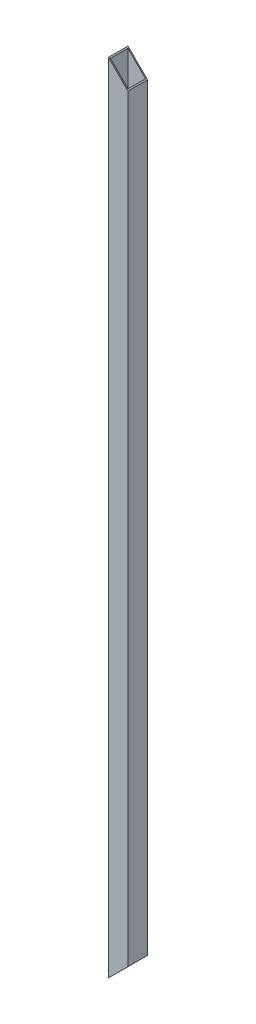
ISO-10303-21;
HEADER;
FILE_DESCRIPTION(('STEP AP214'),'2;1');
FILE_NAME('part.step','',(''),(''),'','','');
FILE_SCHEMA(('AUTOMOTIVE_DESIGN { 1 0 10303 214 1 1 1 1 }'));
ENDSEC;
DATA;
#1=APPLICATION_CONTEXT('core data for automotive mechanical design processes');
#2=APPLICATION_PROTOCOL_DEFINITION('international standard','automotive_design',2000,#1);
#3=PRODUCT_CONTEXT('',#1,'mechanical');
#4=PRODUCT('Part','Part','',(#3));
#5=PRODUCT_RELATED_PRODUCT_CATEGORY('part','',(#4));
#6=PRODUCT_DEFINITION_FORMATION('','',#4);
#7=PRODUCT_DEFINITION_CONTEXT('part definition',#1,'design');
#8=PRODUCT_DEFINITION('design','',#6,#7);
#9=PRODUCT_DEFINITION_SHAPE('','',#8);
#10=(LENGTH_UNIT() NAMED_UNIT(*) SI_UNIT(.MILLI.,.METRE.));
#11=(NAMED_UNIT(*) PLANE_ANGLE_UNIT() SI_UNIT($,.RADIAN.));
#12=(NAMED_UNIT(*) SI_UNIT($,.STERADIAN.) SOLID_ANGLE_UNIT());
#13=UNCERTAINTY_MEASURE_WITH_UNIT(LENGTH_MEASURE(1.E-05),#10,'distance_accuracy_value','');
#14=(GEOMETRIC_REPRESENTATION_CONTEXT(3) GLOBAL_UNCERTAINTY_ASSIGNED_CONTEXT((#13)) GLOBAL_UNIT_ASSIGNED_CONTEXT((#10,
#11,#12)) REPRESENTATION_CONTEXT('',''));
#15=CARTESIAN_POINT('',(0.,0.,0.));
#16=DIRECTION('',(0.,0.,1.));
#17=DIRECTION('',(1.,0.,0.));
#18=AXIS2_PLACEMENT_3D('',#15,#16,#17);
#19=CARTESIAN_POINT('',(925.,-56.568542494924,-40.));
#20=DIRECTION('',(0.,0.,-1.));
#21=DIRECTION('',(-1.,0.,0.));
#22=AXIS2_PLACEMENT_3D('',#19,#20,#21);
#23=PLANE('',#22);
#24=DIRECTION('',(0.707106781186551,-0.707106781186544,0.));
#25=VECTOR('',#24,1.);
#26=CARTESIAN_POINT('',(1278.25,1278.25000000001,-40.));
#27=LINE('',#26,#25);
#28=CARTESIAN_POINT('',(925.,1631.5,-40.));
#29=VERTEX_POINT('',#28);
#30=CARTESIAN_POINT('',(965.,1591.5,-40.));
#31=VERTEX_POINT('',#30);
#32=EDGE_CURVE('E100',#29,#31,#27,.T.);
#33=ORIENTED_EDGE('',*,*,#32,.T.);
#34=DIRECTION('',(0.,1.,0.));
#35=VECTOR('',#34,1.);
#36=CARTESIAN_POINT('',(965.,-56.568542494924,-40.));
#37=LINE('',#36,#35);
#38=CARTESIAN_POINT('',(965.,39.9999999999991,-40.));
#39=VERTEX_POINT('',#38);
#40=EDGE_CURVE('E113',#39,#31,#37,.T.);
#41=ORIENTED_EDGE('',*,*,#40,.F.);
#42=DIRECTION('',(0.707106781186551,0.707106781186544,0.));
#43=VECTOR('',#42,1.);
#44=CARTESIAN_POINT('',(462.499999999995,-462.5,-40.));
#45=LINE('',#44,#43);
#46=CARTESIAN_POINT('',(925.,0.,-40.));
#47=VERTEX_POINT('',#46);
#48=EDGE_CURVE('E151',#47,#39,#45,.T.);
#49=ORIENTED_EDGE('',*,*,#48,.F.);
#50=DIRECTION('',(0.,1.,0.));
#51=VECTOR('',#50,1.);
#52=CARTESIAN_POINT('',(925.,-56.568542494924,-40.));
#53=LINE('',#52,#51);
#54=EDGE_CURVE('E115',#47,#29,#53,.T.);
#55=ORIENTED_EDGE('',*,*,#54,.T.);
#56=EDGE_LOOP('',(#33,#41,#49,#55));
#57=FACE_BOUND('',#56,.T.);
#58=ADVANCED_FACE('F33',(#57),#23,.T.);
#59=CARTESIAN_POINT('',(965.,-56.568542494924,0.));
#60=DIRECTION('',(1.,0.,0.));
#61=DIRECTION('',(0.,0.,-1.));
#62=AXIS2_PLACEMENT_3D('',#59,#60,#61);
#63=PLANE('',#62);
#64=DIRECTION('',(0.,0.,1.));
#65=VECTOR('',#64,1.);
#66=CARTESIAN_POINT('',(965.,1591.5,-96.5685424949234));
#67=LINE('',#66,#65);
#68=CARTESIAN_POINT('',(965.,1591.5,0.));
#69=VERTEX_POINT('',#68);
#70=EDGE_CURVE('E97',#31,#69,#67,.T.);
#71=ORIENTED_EDGE('',*,*,#70,.T.);
#72=DIRECTION('',(0.,1.,0.));
#73=VECTOR('',#72,1.);
#74=CARTESIAN_POINT('',(965.,-56.568542494924,0.));
#75=LINE('',#74,#73);
#76=CARTESIAN_POINT('',(965.,39.9999999999991,0.));
#77=VERTEX_POINT('',#76);
#78=EDGE_CURVE('E121',#77,#69,#75,.T.);
#79=ORIENTED_EDGE('',*,*,#78,.F.);
#80=DIRECTION('',(0.,0.,1.));
#81=VECTOR('',#80,1.);
#82=CARTESIAN_POINT('',(965.,39.9999999999991,-96.5685424949234));
#83=LINE('',#82,#81);
#84=EDGE_CURVE('E120',#39,#77,#83,.T.);
#85=ORIENTED_EDGE('',*,*,#84,.F.);
#86=ORIENTED_EDGE('',*,*,#40,.T.);
#87=EDGE_LOOP('',(#71,#79,#85,#86));
#88=FACE_BOUND('',#87,.T.);
#89=ADVANCED_FACE('F119',(#88),#63,.T.);
#90=CARTESIAN_POINT('',(925.,-56.568542494924,0.));
#91=DIRECTION('',(0.,0.,1.));
#92=DIRECTION('',(1.,0.,0.));
#93=AXIS2_PLACEMENT_3D('',#90,#91,#92);
#94=PLANE('',#93);
#95=DIRECTION('',(0.707106781186551,-0.707106781186544,0.));
#96=VECTOR('',#95,1.);
#97=CARTESIAN_POINT('',(1278.25,1278.25000000001,0.));
#98=LINE('',#97,#96);
#99=CARTESIAN_POINT('',(925.,1631.5,0.));
#100=VERTEX_POINT('',#99);
#101=EDGE_CURVE('E103',#100,#69,#98,.T.);
#102=ORIENTED_EDGE('',*,*,#101,.F.);
#103=DIRECTION('',(0.,1.,0.));
#104=VECTOR('',#103,1.);
#105=CARTESIAN_POINT('',(925.,-56.568542494924,0.));
#106=LINE('',#105,#104);
#107=CARTESIAN_POINT('',(925.,0.,0.));
#108=VERTEX_POINT('',#107);
#109=EDGE_CURVE('E125',#108,#100,#106,.T.);
#110=ORIENTED_EDGE('',*,*,#109,.F.);
#111=DIRECTION('',(0.707106781186551,0.707106781186544,0.));
#112=VECTOR('',#111,1.);
#113=CARTESIAN_POINT('',(462.499999999995,-462.5,0.));
#114=LINE('',#113,#112);
#115=EDGE_CURVE('E158',#108,#77,#114,.T.);
#116=ORIENTED_EDGE('',*,*,#115,.T.);
#117=ORIENTED_EDGE('',*,*,#78,.T.);
#118=EDGE_LOOP('',(#102,#110,#116,#117));
#119=FACE_BOUND('',#118,.T.);
#120=ADVANCED_FACE('F173',(#119),#94,.T.);
#121=CARTESIAN_POINT('',(927.,-56.568542494924,-2.));
#122=DIRECTION('',(-1.,0.,0.));
#123=DIRECTION('',(0.,0.,1.));
#124=AXIS2_PLACEMENT_3D('',#121,#122,#123);
#125=PLANE('',#124);
#126=DIRECTION('',(0.,1.,0.));
#127=VECTOR('',#126,1.);
#128=CARTESIAN_POINT('',(927.,-56.568542494924,-38.));
#129=LINE('',#128,#127);
#130=CARTESIAN_POINT('',(927.,1.99999999999949,-38.));
#131=VERTEX_POINT('',#130);
#132=CARTESIAN_POINT('',(927.,1629.5,-38.));
#133=VERTEX_POINT('',#132);
#134=EDGE_CURVE('E123',#131,#133,#129,.T.);
#135=ORIENTED_EDGE('',*,*,#134,.T.);
#136=DIRECTION('',(0.,0.,1.));
#137=VECTOR('',#136,1.);
#138=CARTESIAN_POINT('',(927.,1629.5,-2.));
#139=LINE('',#138,#137);
#140=CARTESIAN_POINT('',(927.,1629.5,-2.));
#141=VERTEX_POINT('',#140);
#142=EDGE_CURVE('E149',#133,#141,#139,.T.);
#143=ORIENTED_EDGE('',*,*,#142,.T.);
#144=DIRECTION('',(0.,1.,0.));
#145=VECTOR('',#144,1.);
#146=CARTESIAN_POINT('',(927.,-56.568542494924,-2.));
#147=LINE('',#146,#145);
#148=CARTESIAN_POINT('',(927.,1.99999999999954,-2.));
#149=VERTEX_POINT('',#148);
#150=EDGE_CURVE('E37',#149,#141,#147,.T.);
#151=ORIENTED_EDGE('',*,*,#150,.F.);
#152=DIRECTION('',(0.,0.,1.));
#153=VECTOR('',#152,1.);
#154=CARTESIAN_POINT('',(927.,1.99999999999949,-2.));
#155=LINE('',#154,#153);
#156=EDGE_CURVE('E57',#131,#149,#155,.T.);
#157=ORIENTED_EDGE('',*,*,#156,.F.);
#158=EDGE_LOOP('',(#135,#143,#151,#157));
#159=FACE_BOUND('',#158,.T.);
#160=ADVANCED_FACE('F35',(#159),#125,.F.);
#161=CARTESIAN_POINT('',(927.,-56.568542494924,-38.));
#162=DIRECTION('',(0.,0.,-1.));
#163=DIRECTION('',(-1.,0.,0.));
#164=AXIS2_PLACEMENT_3D('',#161,#162,#163);
#165=PLANE('',#164);
#166=DIRECTION('',(0.,1.,0.));
#167=VECTOR('',#166,1.);
#168=CARTESIAN_POINT('',(963.,-56.568542494924,-38.));
#169=LINE('',#168,#167);
#170=CARTESIAN_POINT('',(963.,37.9999999999991,-38.));
#171=VERTEX_POINT('',#170);
#172=CARTESIAN_POINT('',(963.,1593.5,-38.));
#173=VERTEX_POINT('',#172);
#174=EDGE_CURVE('E134',#171,#173,#169,.T.);
#175=ORIENTED_EDGE('',*,*,#174,.T.);
#176=DIRECTION('',(-0.707106781186551,0.707106781186544,0.));
#177=VECTOR('',#176,1.);
#178=CARTESIAN_POINT('',(1770.03427124746,786.465728752548,-38.));
#179=LINE('',#178,#177);
#180=EDGE_CURVE('E152',#173,#133,#179,.T.);
#181=ORIENTED_EDGE('',*,*,#180,.T.);
#182=ORIENTED_EDGE('',*,*,#134,.F.);
#183=DIRECTION('',(-0.707106781186551,-0.707106781186544,0.));
#184=VECTOR('',#183,1.);
#185=CARTESIAN_POINT('',(897.715728752538,-27.284271247462,-38.));
#186=LINE('',#185,#184);
#187=EDGE_CURVE('E165',#171,#131,#186,.T.);
#188=ORIENTED_EDGE('',*,*,#187,.F.);
#189=EDGE_LOOP('',(#175,#181,#182,#188));
#190=FACE_BOUND('',#189,.T.);
#191=ADVANCED_FACE('F180',(#190),#165,.F.);
#192=CARTESIAN_POINT('',(963.,-56.568542494924,-2.));
#193=DIRECTION('',(1.,0.,0.));
#194=DIRECTION('',(0.,0.,-1.));
#195=AXIS2_PLACEMENT_3D('',#192,#193,#194);
#196=PLANE('',#195);
#197=DIRECTION('',(0.,1.,0.));
#198=VECTOR('',#197,1.);
#199=CARTESIAN_POINT('',(963.,-56.568542494924,-2.));
#200=LINE('',#199,#198);
#201=CARTESIAN_POINT('',(963.,37.9999999999992,-2.));
#202=VERTEX_POINT('',#201);
#203=CARTESIAN_POINT('',(963.,1593.5,-2.));
#204=VERTEX_POINT('',#203);
#205=EDGE_CURVE('E136',#202,#204,#200,.T.);
#206=ORIENTED_EDGE('',*,*,#205,.T.);
#207=DIRECTION('',(0.,0.,-1.));
#208=VECTOR('',#207,1.);
#209=CARTESIAN_POINT('',(963.,1593.5,-2.));
#210=LINE('',#209,#208);
#211=EDGE_CURVE('E49',#204,#173,#210,.T.);
#212=ORIENTED_EDGE('',*,*,#211,.T.);
#213=ORIENTED_EDGE('',*,*,#174,.F.);
#214=DIRECTION('',(0.,0.,-1.));
#215=VECTOR('',#214,1.);
#216=CARTESIAN_POINT('',(963.,37.9999999999991,-2.));
#217=LINE('',#216,#215);
#218=EDGE_CURVE('E163',#202,#171,#217,.T.);
#219=ORIENTED_EDGE('',*,*,#218,.F.);
#220=EDGE_LOOP('',(#206,#212,#213,#219));
#221=FACE_BOUND('',#220,.T.);
#222=ADVANCED_FACE('F177',(#221),#196,.F.);
#223=CARTESIAN_POINT('',(927.,-56.568542494924,-2.));
#224=DIRECTION('',(0.,0.,1.));
#225=DIRECTION('',(1.,0.,0.));
#226=AXIS2_PLACEMENT_3D('',#223,#224,#225);
#227=PLANE('',#226);
#228=ORIENTED_EDGE('',*,*,#150,.T.);
#229=DIRECTION('',(0.707106781186551,-0.707106781186544,0.));
#230=VECTOR('',#229,1.);
#231=CARTESIAN_POINT('',(1770.03427124746,786.465728752548,-2.));
#232=LINE('',#231,#230);
#233=EDGE_CURVE('E108',#141,#204,#232,.T.);
#234=ORIENTED_EDGE('',*,*,#233,.T.);
#235=ORIENTED_EDGE('',*,*,#205,.F.);
#236=DIRECTION('',(0.707106781186551,0.707106781186544,0.));
#237=VECTOR('',#236,1.);
#238=CARTESIAN_POINT('',(897.715728752538,-27.284271247462,-2.));
#239=LINE('',#238,#237);
#240=EDGE_CURVE('E145',#149,#202,#239,.T.);
#241=ORIENTED_EDGE('',*,*,#240,.F.);
#242=EDGE_LOOP('',(#228,#234,#235,#241));
#243=FACE_BOUND('',#242,.T.);
#244=ADVANCED_FACE('F144',(#243),#227,.F.);
#245=CARTESIAN_POINT('',(925.,-56.568542494924,0.));
#246=DIRECTION('',(-1.,0.,0.));
#247=DIRECTION('',(0.,0.,1.));
#248=AXIS2_PLACEMENT_3D('',#245,#246,#247);
#249=PLANE('',#248);
#250=ORIENTED_EDGE('',*,*,#54,.F.);
#251=DIRECTION('',(0.,0.,1.));
#252=VECTOR('',#251,1.);
#253=CARTESIAN_POINT('',(925.,0.,0.));
#254=LINE('',#253,#252);
#255=EDGE_CURVE('E131',#47,#108,#254,.T.);
#256=ORIENTED_EDGE('',*,*,#255,.T.);
#257=ORIENTED_EDGE('',*,*,#109,.T.);
#258=DIRECTION('',(0.,0.,1.));
#259=VECTOR('',#258,1.);
#260=CARTESIAN_POINT('',(925.,1631.5,0.));
#261=LINE('',#260,#259);
#262=EDGE_CURVE('E11',#29,#100,#261,.T.);
#263=ORIENTED_EDGE('',*,*,#262,.F.);
#264=EDGE_LOOP('',(#250,#256,#257,#263));
#265=FACE_BOUND('',#264,.T.);
#266=ADVANCED_FACE('F170',(#265),#249,.T.);
#267=CARTESIAN_POINT('',(462.499999999995,-462.5,-96.5685424949234));
#268=DIRECTION('',(0.707106781186544,-0.707106781186551,0.));
#269=DIRECTION('',(0.707106781186551,0.707106781186544,0.));
#270=AXIS2_PLACEMENT_3D('',#267,#268,#269);
#271=PLANE('',#270);
#272=ORIENTED_EDGE('',*,*,#48,.T.);
#273=ORIENTED_EDGE('',*,*,#84,.T.);
#274=ORIENTED_EDGE('',*,*,#115,.F.);
#275=ORIENTED_EDGE('',*,*,#255,.F.);
#276=EDGE_LOOP('',(#272,#273,#274,#275));
#277=FACE_BOUND('',#276,.T.);
#278=ORIENTED_EDGE('',*,*,#156,.T.);
#279=ORIENTED_EDGE('',*,*,#240,.T.);
#280=ORIENTED_EDGE('',*,*,#218,.T.);
#281=ORIENTED_EDGE('',*,*,#187,.T.);
#282=EDGE_LOOP('',(#278,#279,#280,#281));
#283=FACE_BOUND('',#282,.T.);
#284=ADVANCED_FACE('F181',(#277,#283),#271,.T.);
#285=CARTESIAN_POINT('',(1278.25,1278.25000000001,-96.5685424949234));
#286=DIRECTION('',(-0.707106781186544,-0.707106781186551,0.));
#287=DIRECTION('',(0.707106781186551,-0.707106781186544,0.));
#288=AXIS2_PLACEMENT_3D('',#285,#286,#287);
#289=PLANE('',#288);
#290=ORIENTED_EDGE('',*,*,#262,.T.);
#291=ORIENTED_EDGE('',*,*,#101,.T.);
#292=ORIENTED_EDGE('',*,*,#70,.F.);
#293=ORIENTED_EDGE('',*,*,#32,.F.);
#294=EDGE_LOOP('',(#290,#291,#292,#293));
#295=FACE_BOUND('',#294,.T.);
#296=ORIENTED_EDGE('',*,*,#180,.F.);
#297=ORIENTED_EDGE('',*,*,#211,.F.);
#298=ORIENTED_EDGE('',*,*,#233,.F.);
#299=ORIENTED_EDGE('',*,*,#142,.F.);
#300=EDGE_LOOP('',(#296,#297,#298,#299));
#301=FACE_BOUND('',#300,.T.);
#302=ADVANCED_FACE('F99',(#295,#301),#289,.F.);
#303=CLOSED_SHELL('',(#58,#89,#120,#160,#191,#222,#244,#266,#284,#302));
#304=MANIFOLD_SOLID_BREP('B2',#303);
#305=ADVANCED_BREP_SHAPE_REPRESENTATION('',(#18,#304),#14);
#306=SHAPE_DEFINITION_REPRESENTATION(#9,#305);
ENDSEC;
END-ISO-10303-21;
